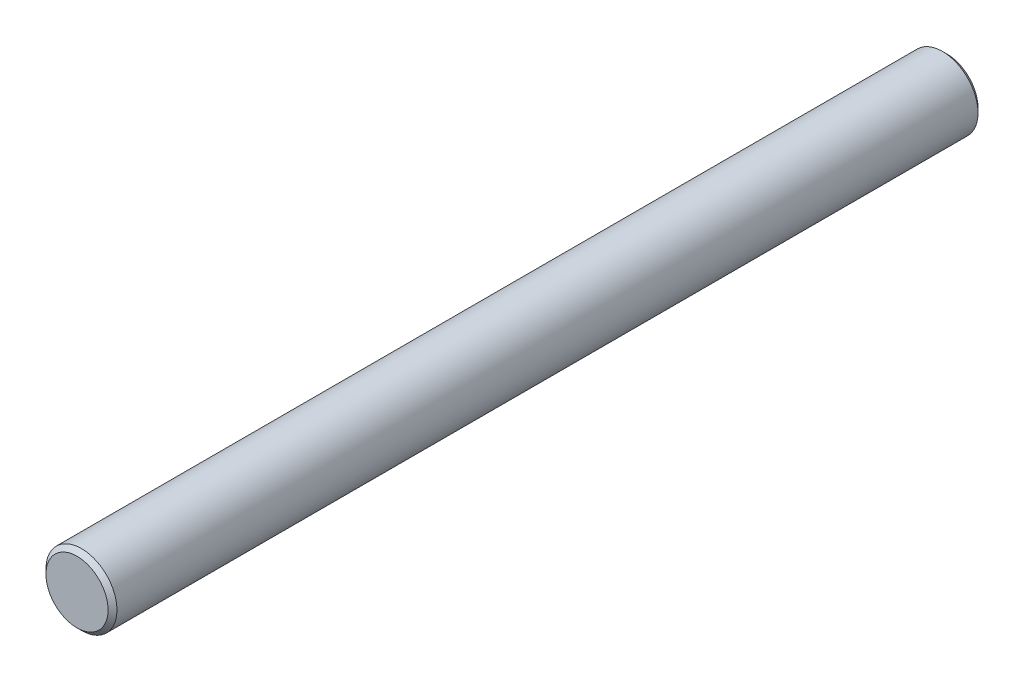
ISO-10303-21;
HEADER;
FILE_DESCRIPTION(('STEP AP214'),'2;1');
FILE_NAME('part.step','',(''),(''),'','','');
FILE_SCHEMA(('AUTOMOTIVE_DESIGN { 1 0 10303 214 1 1 1 1 }'));
ENDSEC;
DATA;
#1=APPLICATION_CONTEXT('core data for automotive mechanical design processes');
#2=APPLICATION_PROTOCOL_DEFINITION('international standard','automotive_design',2000,#1);
#3=PRODUCT_CONTEXT('',#1,'mechanical');
#4=PRODUCT('Part','Part','',(#3));
#5=PRODUCT_RELATED_PRODUCT_CATEGORY('part','',(#4));
#6=PRODUCT_DEFINITION_FORMATION('','',#4);
#7=PRODUCT_DEFINITION_CONTEXT('part definition',#1,'design');
#8=PRODUCT_DEFINITION('design','',#6,#7);
#9=PRODUCT_DEFINITION_SHAPE('','',#8);
#10=(LENGTH_UNIT() NAMED_UNIT(*) SI_UNIT(.MILLI.,.METRE.));
#11=(NAMED_UNIT(*) PLANE_ANGLE_UNIT() SI_UNIT($,.RADIAN.));
#12=(NAMED_UNIT(*) SI_UNIT($,.STERADIAN.) SOLID_ANGLE_UNIT());
#13=UNCERTAINTY_MEASURE_WITH_UNIT(LENGTH_MEASURE(1.E-05),#10,'distance_accuracy_value','');
#14=(GEOMETRIC_REPRESENTATION_CONTEXT(3) GLOBAL_UNCERTAINTY_ASSIGNED_CONTEXT((#13)) GLOBAL_UNIT_ASSIGNED_CONTEXT((#10,
#11,#12)) REPRESENTATION_CONTEXT('',''));
#15=CARTESIAN_POINT('',(0.,0.,0.));
#16=DIRECTION('',(0.,0.,1.));
#17=DIRECTION('',(1.,0.,0.));
#18=AXIS2_PLACEMENT_3D('',#15,#16,#17);
#19=CARTESIAN_POINT('',(0.,0.,98.));
#20=DIRECTION('',(0.,0.,-1.));
#21=DIRECTION('',(-1.,0.,0.));
#22=AXIS2_PLACEMENT_3D('',#19,#20,#21);
#23=CYLINDRICAL_SURFACE('',#22,4.);
#24=CARTESIAN_POINT('',(0.,0.,0.499999999999973));
#25=DIRECTION('',(0.,0.,1.));
#26=DIRECTION('',(1.,0.,0.));
#27=AXIS2_PLACEMENT_3D('',#24,#25,#26);
#28=CIRCLE('',#27,4.);
#29=CARTESIAN_POINT('',(4.,0.,0.499999999999973));
#30=VERTEX_POINT('',#29);
#31=EDGE_CURVE('E51',#30,#30,#28,.T.);
#32=ORIENTED_EDGE('',*,*,#31,.T.);
#33=EDGE_LOOP('',(#32));
#34=FACE_BOUND('',#33,.T.);
#35=CARTESIAN_POINT('',(0.,0.,97.5));
#36=DIRECTION('',(0.,0.,1.));
#37=DIRECTION('',(1.,0.,0.));
#38=AXIS2_PLACEMENT_3D('',#35,#36,#37);
#39=CIRCLE('',#38,4.);
#40=CARTESIAN_POINT('',(4.,0.,97.5));
#41=VERTEX_POINT('',#40);
#42=EDGE_CURVE('E55',#41,#41,#39,.F.);
#43=ORIENTED_EDGE('',*,*,#42,.T.);
#44=EDGE_LOOP('',(#43));
#45=FACE_BOUND('',#44,.T.);
#46=ADVANCED_FACE('F39',(#34,#45),#23,.T.);
#47=CARTESIAN_POINT('',(0.,0.,98.));
#48=DIRECTION('',(0.,0.,1.));
#49=DIRECTION('',(1.,0.,0.));
#50=AXIS2_PLACEMENT_3D('',#47,#48,#49);
#51=PLANE('',#50);
#52=CARTESIAN_POINT('',(0.,0.,98.));
#53=DIRECTION('',(0.,0.,1.));
#54=DIRECTION('',(1.,0.,0.));
#55=AXIS2_PLACEMENT_3D('',#52,#53,#54);
#56=CIRCLE('',#55,3.50000000000002);
#57=CARTESIAN_POINT('',(3.50000000000002,0.,98.));
#58=VERTEX_POINT('',#57);
#59=EDGE_CURVE('E10',#58,#58,#56,.T.);
#60=ORIENTED_EDGE('',*,*,#59,.T.);
#61=EDGE_LOOP('',(#60));
#62=FACE_BOUND('',#61,.T.);
#63=ADVANCED_FACE('F71',(#62),#51,.T.);
#64=CARTESIAN_POINT('',(0.,0.,0.));
#65=DIRECTION('',(0.,0.,1.));
#66=DIRECTION('',(1.,0.,0.));
#67=AXIS2_PLACEMENT_3D('',#64,#65,#66);
#68=PLANE('',#67);
#69=CARTESIAN_POINT('',(0.,0.,0.));
#70=DIRECTION('',(0.,0.,1.));
#71=DIRECTION('',(1.,0.,0.));
#72=AXIS2_PLACEMENT_3D('',#69,#70,#71);
#73=CIRCLE('',#72,3.50000000000002);
#74=CARTESIAN_POINT('',(3.50000000000002,0.,0.));
#75=VERTEX_POINT('',#74);
#76=EDGE_CURVE('E47',#75,#75,#73,.F.);
#77=ORIENTED_EDGE('',*,*,#76,.T.);
#78=EDGE_LOOP('',(#77));
#79=FACE_BOUND('',#78,.T.);
#80=ADVANCED_FACE('F68',(#79),#68,.F.);
#81=CARTESIAN_POINT('',(0.,0.,0.499999999999973));
#82=DIRECTION('',(0.,0.,1.));
#83=DIRECTION('',(1.,0.,0.));
#84=AXIS2_PLACEMENT_3D('',#81,#82,#83);
#85=CONICAL_SURFACE('',#84,4.,0.785398163397459);
#86=ORIENTED_EDGE('',*,*,#76,.F.);
#87=EDGE_LOOP('',(#86));
#88=FACE_BOUND('',#87,.T.);
#89=ORIENTED_EDGE('',*,*,#31,.F.);
#90=EDGE_LOOP('',(#89));
#91=FACE_BOUND('',#90,.T.);
#92=ADVANCED_FACE('F64',(#88,#91),#85,.T.);
#93=CARTESIAN_POINT('',(0.,0.,98.));
#94=DIRECTION('',(0.,0.,-1.));
#95=DIRECTION('',(-1.,0.,0.));
#96=AXIS2_PLACEMENT_3D('',#93,#94,#95);
#97=CONICAL_SURFACE('',#96,3.50000000000002,0.785398163397445);
#98=ORIENTED_EDGE('',*,*,#42,.F.);
#99=EDGE_LOOP('',(#98));
#100=FACE_BOUND('',#99,.T.);
#101=ORIENTED_EDGE('',*,*,#59,.F.);
#102=EDGE_LOOP('',(#101));
#103=FACE_BOUND('',#102,.T.);
#104=ADVANCED_FACE('F42',(#100,#103),#97,.T.);
#105=CLOSED_SHELL('',(#46,#63,#80,#92,#104));
#106=MANIFOLD_SOLID_BREP('B2',#105);
#107=ADVANCED_BREP_SHAPE_REPRESENTATION('',(#18,#106),#14);
#108=SHAPE_DEFINITION_REPRESENTATION(#9,#107);
ENDSEC;
END-ISO-10303-21;
